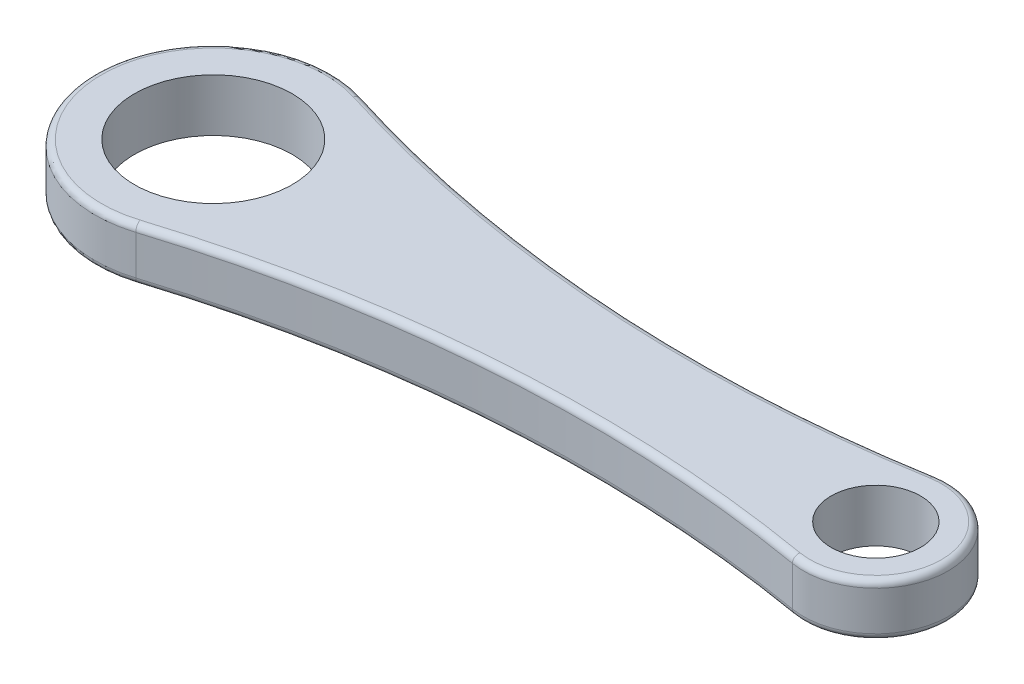
ISO-10303-21;
HEADER;
FILE_DESCRIPTION(('STEP AP214'),'2;1');
FILE_NAME('part.step','',(''),(''),'','','');
FILE_SCHEMA(('AUTOMOTIVE_DESIGN { 1 0 10303 214 1 1 1 1 }'));
ENDSEC;
DATA;
#1=APPLICATION_CONTEXT('core data for automotive mechanical design processes');
#2=APPLICATION_PROTOCOL_DEFINITION('international standard','automotive_design',2000,#1);
#3=PRODUCT_CONTEXT('',#1,'mechanical');
#4=PRODUCT('Part','Part','',(#3));
#5=PRODUCT_RELATED_PRODUCT_CATEGORY('part','',(#4));
#6=PRODUCT_DEFINITION_FORMATION('','',#4);
#7=PRODUCT_DEFINITION_CONTEXT('part definition',#1,'design');
#8=PRODUCT_DEFINITION('design','',#6,#7);
#9=PRODUCT_DEFINITION_SHAPE('','',#8);
#10=(LENGTH_UNIT() NAMED_UNIT(*) SI_UNIT(.MILLI.,.METRE.));
#11=(NAMED_UNIT(*) PLANE_ANGLE_UNIT() SI_UNIT($,.RADIAN.));
#12=(NAMED_UNIT(*) SI_UNIT($,.STERADIAN.) SOLID_ANGLE_UNIT());
#13=UNCERTAINTY_MEASURE_WITH_UNIT(LENGTH_MEASURE(1.E-05),#10,'distance_accuracy_value','');
#14=(GEOMETRIC_REPRESENTATION_CONTEXT(3) GLOBAL_UNCERTAINTY_ASSIGNED_CONTEXT((#13)) GLOBAL_UNIT_ASSIGNED_CONTEXT((#10,
#11,#12)) REPRESENTATION_CONTEXT('',''));
#15=CARTESIAN_POINT('',(0.,0.,0.));
#16=DIRECTION('',(0.,0.,1.));
#17=DIRECTION('',(1.,0.,0.));
#18=AXIS2_PLACEMENT_3D('',#15,#16,#17);
#19=CARTESIAN_POINT('',(41.5295907515883,4.,-52.0811068228716));
#20=DIRECTION('',(0.,1.,0.));
#21=DIRECTION('',(0.,0.,0.999999999999999));
#22=AXIS2_PLACEMENT_3D('',#19,#20,#21);
#23=PLANE('',#22);
#24=CARTESIAN_POINT('',(32.6591815031766,3.99999999999999,-104.162213645743));
#25=DIRECTION('',(0.,1.,0.));
#26=DIRECTION('',(0.,0.,0.999999999999999));
#27=AXIS2_PLACEMENT_3D('',#24,#25,#26);
#28=CIRCLE('',#27,100.662213645743);
#29=CARTESIAN_POINT('',(49.5604937146072,4.,-4.92901909073053));
#30=VERTEX_POINT('',#29);
#31=CARTESIAN_POINT('',(2.54303236903831,3.99999999999999,-8.11067114177509));
#32=VERTEX_POINT('',#31);
#33=EDGE_CURVE('E51',#30,#32,#28,.F.);
#34=ORIENTED_EDGE('',*,*,#33,.T.);
#35=CARTESIAN_POINT('',(0.,4.,0.));
#36=DIRECTION('',(0.,1.,0.));
#37=DIRECTION('',(0.,0.,0.999999999999999));
#38=AXIS2_PLACEMENT_3D('',#35,#36,#37);
#39=CIRCLE('',#38,8.49999999999999);
#40=CARTESIAN_POINT('',(2.54303236903829,4.,8.11067114177508));
#41=VERTEX_POINT('',#40);
#42=EDGE_CURVE('E110',#32,#41,#39,.T.);
#43=ORIENTED_EDGE('',*,*,#42,.T.);
#44=CARTESIAN_POINT('',(32.6591815031766,4.,104.162213645743));
#45=DIRECTION('',(0.,1.,0.));
#46=DIRECTION('',(0.,0.,0.999999999999999));
#47=AXIS2_PLACEMENT_3D('',#44,#45,#46);
#48=CIRCLE('',#47,100.662213645743);
#49=CARTESIAN_POINT('',(49.5604937146072,4.,4.92901909073052));
#50=VERTEX_POINT('',#49);
#51=EDGE_CURVE('E133',#41,#50,#48,.F.);
#52=ORIENTED_EDGE('',*,*,#51,.T.);
#53=CARTESIAN_POINT('',(50.4,4.,0.));
#54=DIRECTION('',(0.,1.,0.));
#55=DIRECTION('',(0.,0.,0.999999999999999));
#56=AXIS2_PLACEMENT_3D('',#53,#54,#55);
#57=CIRCLE('',#56,5.);
#58=EDGE_CURVE('E56',#50,#30,#57,.T.);
#59=ORIENTED_EDGE('',*,*,#58,.T.);
#60=EDGE_LOOP('',(#34,#43,#52,#59));
#61=FACE_BOUND('',#60,.T.);
#62=CARTESIAN_POINT('',(0.,4.,0.));
#63=DIRECTION('',(0.,1.,0.));
#64=DIRECTION('',(0.,0.,0.999999999999999));
#65=AXIS2_PLACEMENT_3D('',#62,#63,#64);
#66=CIRCLE('',#65,6.);
#67=CARTESIAN_POINT('',(0.,4.,-6.00000000000001));
#68=VERTEX_POINT('',#67);
#69=EDGE_CURVE('E170',#68,#68,#66,.T.);
#70=ORIENTED_EDGE('',*,*,#69,.F.);
#71=EDGE_LOOP('',(#70));
#72=FACE_BOUND('',#71,.T.);
#73=CARTESIAN_POINT('',(50.4,4.,0.));
#74=DIRECTION('',(0.,1.,0.));
#75=DIRECTION('',(0.,0.,0.999999999999999));
#76=AXIS2_PLACEMENT_3D('',#73,#74,#75);
#77=CIRCLE('',#76,3.4);
#78=CARTESIAN_POINT('',(50.4,4.,-3.40000000000001));
#79=VERTEX_POINT('',#78);
#80=EDGE_CURVE('E162',#79,#79,#77,.T.);
#81=ORIENTED_EDGE('',*,*,#80,.F.);
#82=EDGE_LOOP('',(#81));
#83=FACE_BOUND('',#82,.T.);
#84=ADVANCED_FACE('F34',(#61,#72,#83),#23,.T.);
#85=CARTESIAN_POINT('',(41.5295907515883,0.,-52.0811068228716));
#86=DIRECTION('',(0.,1.,0.));
#87=DIRECTION('',(0.,0.,0.999999999999999));
#88=AXIS2_PLACEMENT_3D('',#85,#86,#87);
#89=PLANE('',#88);
#90=CARTESIAN_POINT('',(32.6591815031766,0.,104.162213645743));
#91=DIRECTION('',(0.,1.,0.));
#92=DIRECTION('',(0.,0.,0.999999999999999));
#93=AXIS2_PLACEMENT_3D('',#90,#91,#92);
#94=CIRCLE('',#93,100.662213645743);
#95=CARTESIAN_POINT('',(49.5604937146072,0.,4.92901909073051));
#96=VERTEX_POINT('',#95);
#97=CARTESIAN_POINT('',(2.54303236903832,0.,8.11067114177508));
#98=VERTEX_POINT('',#97);
#99=EDGE_CURVE('E181',#96,#98,#94,.T.);
#100=ORIENTED_EDGE('',*,*,#99,.T.);
#101=CARTESIAN_POINT('',(0.,0.,0.));
#102=DIRECTION('',(0.,1.,0.));
#103=DIRECTION('',(0.,0.,0.999999999999999));
#104=AXIS2_PLACEMENT_3D('',#101,#102,#103);
#105=CIRCLE('',#104,8.49999999999999);
#106=CARTESIAN_POINT('',(2.54303236903831,0.,-8.11067114177509));
#107=VERTEX_POINT('',#106);
#108=EDGE_CURVE('E187',#98,#107,#105,.F.);
#109=ORIENTED_EDGE('',*,*,#108,.T.);
#110=CARTESIAN_POINT('',(32.6591815031766,0.,-104.162213645743));
#111=DIRECTION('',(0.,1.,0.));
#112=DIRECTION('',(0.,0.,0.999999999999999));
#113=AXIS2_PLACEMENT_3D('',#110,#111,#112);
#114=CIRCLE('',#113,100.662213645743);
#115=CARTESIAN_POINT('',(49.5604937146072,0.,-4.92901909073052));
#116=VERTEX_POINT('',#115);
#117=EDGE_CURVE('E185',#107,#116,#114,.T.);
#118=ORIENTED_EDGE('',*,*,#117,.T.);
#119=CARTESIAN_POINT('',(50.4,0.,0.));
#120=DIRECTION('',(0.,1.,0.));
#121=DIRECTION('',(0.,0.,0.999999999999999));
#122=AXIS2_PLACEMENT_3D('',#119,#120,#121);
#123=CIRCLE('',#122,5.);
#124=EDGE_CURVE('E183',#116,#96,#123,.F.);
#125=ORIENTED_EDGE('',*,*,#124,.T.);
#126=EDGE_LOOP('',(#100,#109,#118,#125));
#127=FACE_BOUND('',#126,.T.);
#128=CARTESIAN_POINT('',(0.,0.,0.));
#129=DIRECTION('',(0.,1.,0.));
#130=DIRECTION('',(0.,0.,0.999999999999999));
#131=AXIS2_PLACEMENT_3D('',#128,#129,#130);
#132=CIRCLE('',#131,6.);
#133=CARTESIAN_POINT('',(0.,0.,-6.00000000000001));
#134=VERTEX_POINT('',#133);
#135=EDGE_CURVE('E167',#134,#134,#132,.T.);
#136=ORIENTED_EDGE('',*,*,#135,.T.);
#137=EDGE_LOOP('',(#136));
#138=FACE_BOUND('',#137,.T.);
#139=CARTESIAN_POINT('',(50.4,0.,0.));
#140=DIRECTION('',(0.,1.,0.));
#141=DIRECTION('',(0.,0.,0.999999999999999));
#142=AXIS2_PLACEMENT_3D('',#139,#140,#141);
#143=CIRCLE('',#142,3.4);
#144=CARTESIAN_POINT('',(50.4,0.,-3.40000000000001));
#145=VERTEX_POINT('',#144);
#146=EDGE_CURVE('E156',#145,#145,#143,.T.);
#147=ORIENTED_EDGE('',*,*,#146,.T.);
#148=EDGE_LOOP('',(#147));
#149=FACE_BOUND('',#148,.T.);
#150=ADVANCED_FACE('F227',(#127,#138,#149),#89,.F.);
#151=CARTESIAN_POINT('',(32.6591815031766,3.99999999999999,-104.162213645743));
#152=DIRECTION('',(0.,-1.,0.));
#153=DIRECTION('',(0.,0.,-0.999999999999999));
#154=AXIS2_PLACEMENT_3D('',#151,#152,#153);
#155=CYLINDRICAL_SURFACE('',#154,100.162213645743);
#156=DIRECTION('',(0.,-1.,0.));
#157=VECTOR('',#156,1.);
#158=CARTESIAN_POINT('',(49.4765430860679,4.,-5.42192099980359));
#159=LINE('',#158,#157);
#160=CARTESIAN_POINT('',(49.4765430860679,3.5,-5.42192099980358));
#161=VERTEX_POINT('',#160);
#162=CARTESIAN_POINT('',(49.4765430860679,0.5,-5.4219209998036));
#163=VERTEX_POINT('',#162);
#164=EDGE_CURVE('E173',#161,#163,#159,.T.);
#165=ORIENTED_EDGE('',*,*,#164,.T.);
#166=CARTESIAN_POINT('',(32.6591815031766,0.5,-104.162213645743));
#167=DIRECTION('',(0.,1.,0.));
#168=DIRECTION('',(0.,0.,0.999999999999999));
#169=AXIS2_PLACEMENT_3D('',#166,#167,#168);
#170=CIRCLE('',#169,100.162213645743);
#171=CARTESIAN_POINT('',(2.69262250839352,0.5,-8.58776944423245));
#172=VERTEX_POINT('',#171);
#173=EDGE_CURVE('E192',#163,#172,#170,.F.);
#174=ORIENTED_EDGE('',*,*,#173,.T.);
#175=DIRECTION('',(0.,-1.,0.));
#176=VECTOR('',#175,1.);
#177=CARTESIAN_POINT('',(2.69262250839352,4.,-8.58776944423247));
#178=LINE('',#177,#176);
#179=CARTESIAN_POINT('',(2.69262250839351,3.5,-8.58776944423246));
#180=VERTEX_POINT('',#179);
#181=EDGE_CURVE('E122',#180,#172,#178,.T.);
#182=ORIENTED_EDGE('',*,*,#181,.F.);
#183=CARTESIAN_POINT('',(32.6591815031766,3.49999999999999,-104.162213645743));
#184=DIRECTION('',(0.,1.,0.));
#185=DIRECTION('',(0.,0.,0.999999999999999));
#186=AXIS2_PLACEMENT_3D('',#183,#184,#185);
#187=CIRCLE('',#186,100.162213645743);
#188=EDGE_CURVE('E190',#180,#161,#187,.T.);
#189=ORIENTED_EDGE('',*,*,#188,.T.);
#190=EDGE_LOOP('',(#165,#174,#182,#189));
#191=FACE_BOUND('',#190,.T.);
#192=ADVANCED_FACE('F207',(#191),#155,.F.);
#193=CARTESIAN_POINT('',(0.,4.,0.));
#194=DIRECTION('',(0.,-1.,0.));
#195=DIRECTION('',(0.,0.,-0.999999999999999));
#196=AXIS2_PLACEMENT_3D('',#193,#194,#195);
#197=CYLINDRICAL_SURFACE('',#196,9.);
#198=ORIENTED_EDGE('',*,*,#181,.T.);
#199=CARTESIAN_POINT('',(0.,0.5,0.));
#200=DIRECTION('',(0.,1.,0.));
#201=DIRECTION('',(0.,0.,0.999999999999999));
#202=AXIS2_PLACEMENT_3D('',#199,#200,#201);
#203=CIRCLE('',#202,9.);
#204=CARTESIAN_POINT('',(2.69262250839349,0.5,8.58776944423243));
#205=VERTEX_POINT('',#204);
#206=EDGE_CURVE('E121',#172,#205,#203,.T.);
#207=ORIENTED_EDGE('',*,*,#206,.T.);
#208=DIRECTION('',(0.,-1.,0.));
#209=VECTOR('',#208,1.);
#210=CARTESIAN_POINT('',(2.69262250839347,4.,8.58776944423243));
#211=LINE('',#210,#209);
#212=CARTESIAN_POINT('',(2.69262250839346,3.5,8.58776944423242));
#213=VERTEX_POINT('',#212);
#214=EDGE_CURVE('E103',#213,#205,#211,.T.);
#215=ORIENTED_EDGE('',*,*,#214,.F.);
#216=CARTESIAN_POINT('',(0.,3.5,0.));
#217=DIRECTION('',(0.,1.,0.));
#218=DIRECTION('',(0.,0.,0.999999999999999));
#219=AXIS2_PLACEMENT_3D('',#216,#217,#218);
#220=CIRCLE('',#219,9.);
#221=EDGE_CURVE('E118',#213,#180,#220,.F.);
#222=ORIENTED_EDGE('',*,*,#221,.T.);
#223=EDGE_LOOP('',(#198,#207,#215,#222));
#224=FACE_BOUND('',#223,.T.);
#225=ADVANCED_FACE('F117',(#224),#197,.T.);
#226=CARTESIAN_POINT('',(32.6591815031766,4.,104.162213645743));
#227=DIRECTION('',(0.,-1.,0.));
#228=DIRECTION('',(0.,0.,-0.999999999999999));
#229=AXIS2_PLACEMENT_3D('',#226,#227,#228);
#230=CYLINDRICAL_SURFACE('',#229,100.162213645743);
#231=ORIENTED_EDGE('',*,*,#214,.T.);
#232=CARTESIAN_POINT('',(32.6591815031766,0.499999999999987,104.162213645743));
#233=DIRECTION('',(0.,1.,0.));
#234=DIRECTION('',(0.,0.,0.999999999999999));
#235=AXIS2_PLACEMENT_3D('',#232,#233,#234);
#236=CIRCLE('',#235,100.162213645743);
#237=CARTESIAN_POINT('',(49.4765430860679,0.5,5.42192099980356));
#238=VERTEX_POINT('',#237);
#239=EDGE_CURVE('E11',#205,#238,#236,.F.);
#240=ORIENTED_EDGE('',*,*,#239,.T.);
#241=DIRECTION('',(0.,-1.,0.));
#242=VECTOR('',#241,1.);
#243=CARTESIAN_POINT('',(49.4765430860679,4.,5.42192099980356));
#244=LINE('',#243,#242);
#245=CARTESIAN_POINT('',(49.4765430860679,3.49999999999999,5.42192099980355));
#246=VERTEX_POINT('',#245);
#247=EDGE_CURVE('E105',#246,#238,#244,.T.);
#248=ORIENTED_EDGE('',*,*,#247,.F.);
#249=CARTESIAN_POINT('',(32.6591815031766,3.49999999999999,104.162213645743));
#250=DIRECTION('',(0.,1.,0.));
#251=DIRECTION('',(0.,0.,0.999999999999999));
#252=AXIS2_PLACEMENT_3D('',#249,#250,#251);
#253=CIRCLE('',#252,100.162213645743);
#254=EDGE_CURVE('E43',#246,#213,#253,.T.);
#255=ORIENTED_EDGE('',*,*,#254,.T.);
#256=EDGE_LOOP('',(#231,#240,#248,#255));
#257=FACE_BOUND('',#256,.T.);
#258=ADVANCED_FACE('F102',(#257),#230,.F.);
#259=CARTESIAN_POINT('',(50.4,4.,0.));
#260=DIRECTION('',(0.,-1.,0.));
#261=DIRECTION('',(0.,0.,-0.999999999999999));
#262=AXIS2_PLACEMENT_3D('',#259,#260,#261);
#263=CYLINDRICAL_SURFACE('',#262,5.5);
#264=ORIENTED_EDGE('',*,*,#247,.T.);
#265=CARTESIAN_POINT('',(50.4,0.499999999999987,0.));
#266=DIRECTION('',(0.,1.,0.));
#267=DIRECTION('',(0.,0.,0.999999999999999));
#268=AXIS2_PLACEMENT_3D('',#265,#266,#267);
#269=CIRCLE('',#268,5.5);
#270=EDGE_CURVE('E196',#238,#163,#269,.T.);
#271=ORIENTED_EDGE('',*,*,#270,.T.);
#272=ORIENTED_EDGE('',*,*,#164,.F.);
#273=CARTESIAN_POINT('',(50.4,3.5,0.));
#274=DIRECTION('',(0.,1.,0.));
#275=DIRECTION('',(0.,0.,0.999999999999999));
#276=AXIS2_PLACEMENT_3D('',#273,#274,#275);
#277=CIRCLE('',#276,5.5);
#278=EDGE_CURVE('E194',#161,#246,#277,.F.);
#279=ORIENTED_EDGE('',*,*,#278,.T.);
#280=EDGE_LOOP('',(#264,#271,#272,#279));
#281=FACE_BOUND('',#280,.T.);
#282=ADVANCED_FACE('F209',(#281),#263,.T.);
#283=CARTESIAN_POINT('',(0.,4.,0.));
#284=DIRECTION('',(0.,-1.,0.));
#285=DIRECTION('',(0.,0.,-0.999999999999999));
#286=AXIS2_PLACEMENT_3D('',#283,#284,#285);
#287=CYLINDRICAL_SURFACE('',#286,6.);
#288=CARTESIAN_POINT('',(0.,4.,-6.00000000000001));
#289=CARTESIAN_POINT('',(0.,3.95833333333334,-6.00000000000001));
#290=CARTESIAN_POINT('',(0.,3.91666666666667,-6.00000000000001));
#291=CARTESIAN_POINT('',(0.,3.83333333333334,-6.00000000000001));
#292=CARTESIAN_POINT('',(0.,3.79166666666667,-6.00000000000001));
#293=CARTESIAN_POINT('',(0.,3.70833333333334,-6.00000000000001));
#294=CARTESIAN_POINT('',(0.,3.66666666666667,-6.00000000000001));
#295=CARTESIAN_POINT('',(0.,3.58333333333334,-6.00000000000001));
#296=CARTESIAN_POINT('',(0.,3.54166666666667,-6.00000000000001));
#297=CARTESIAN_POINT('',(0.,3.45833333333334,-6.00000000000001));
#298=CARTESIAN_POINT('',(0.,3.41666666666667,-6.00000000000001));
#299=CARTESIAN_POINT('',(0.,3.33333333333334,-6.00000000000001));
#300=CARTESIAN_POINT('',(0.,3.29166666666667,-6.00000000000001));
#301=CARTESIAN_POINT('',(0.,3.20833333333334,-6.00000000000001));
#302=CARTESIAN_POINT('',(0.,3.16666666666667,-6.00000000000001));
#303=CARTESIAN_POINT('',(0.,3.08333333333334,-6.00000000000001));
#304=CARTESIAN_POINT('',(0.,3.04166666666667,-6.00000000000001));
#305=CARTESIAN_POINT('',(0.,2.95833333333334,-6.00000000000001));
#306=CARTESIAN_POINT('',(0.,2.91666666666667,-6.00000000000001));
#307=CARTESIAN_POINT('',(0.,2.83333333333334,-6.00000000000001));
#308=CARTESIAN_POINT('',(0.,2.79166666666667,-6.00000000000001));
#309=CARTESIAN_POINT('',(0.,2.70833333333334,-6.00000000000001));
#310=CARTESIAN_POINT('',(0.,2.66666666666667,-6.00000000000001));
#311=CARTESIAN_POINT('',(0.,2.58333333333334,-6.00000000000001));
#312=CARTESIAN_POINT('',(0.,2.54166666666667,-6.00000000000001));
#313=CARTESIAN_POINT('',(0.,2.45833333333334,-6.00000000000001));
#314=CARTESIAN_POINT('',(0.,2.41666666666667,-6.00000000000001));
#315=CARTESIAN_POINT('',(0.,2.33333333333334,-6.00000000000001));
#316=CARTESIAN_POINT('',(0.,2.29166666666667,-6.00000000000001));
#317=CARTESIAN_POINT('',(0.,2.20833333333334,-6.00000000000001));
#318=CARTESIAN_POINT('',(0.,2.16666666666667,-6.00000000000001));
#319=CARTESIAN_POINT('',(0.,2.08333333333334,-6.00000000000001));
#320=CARTESIAN_POINT('',(0.,2.04166666666667,-6.00000000000001));
#321=CARTESIAN_POINT('',(0.,1.95833333333334,-6.00000000000001));
#322=CARTESIAN_POINT('',(0.,1.91666666666667,-6.00000000000001));
#323=CARTESIAN_POINT('',(0.,1.83333333333334,-6.00000000000001));
#324=CARTESIAN_POINT('',(0.,1.79166666666667,-6.00000000000001));
#325=CARTESIAN_POINT('',(0.,1.70833333333333,-6.00000000000001));
#326=CARTESIAN_POINT('',(0.,1.66666666666667,-6.00000000000001));
#327=CARTESIAN_POINT('',(0.,1.58333333333333,-6.00000000000001));
#328=CARTESIAN_POINT('',(0.,1.54166666666667,-6.00000000000001));
#329=CARTESIAN_POINT('',(0.,1.45833333333333,-6.00000000000001));
#330=CARTESIAN_POINT('',(0.,1.41666666666667,-6.00000000000001));
#331=CARTESIAN_POINT('',(0.,1.33333333333333,-6.00000000000001));
#332=CARTESIAN_POINT('',(0.,1.29166666666667,-6.00000000000001));
#333=CARTESIAN_POINT('',(0.,1.20833333333333,-6.00000000000001));
#334=CARTESIAN_POINT('',(0.,1.16666666666667,-6.00000000000001));
#335=CARTESIAN_POINT('',(0.,1.08333333333333,-6.00000000000001));
#336=CARTESIAN_POINT('',(0.,1.04166666666667,-6.00000000000001));
#337=CARTESIAN_POINT('',(0.,0.958333333333334,-6.00000000000001));
#338=CARTESIAN_POINT('',(0.,0.916666666666667,-6.00000000000001));
#339=CARTESIAN_POINT('',(0.,0.833333333333333,-6.00000000000001));
#340=CARTESIAN_POINT('',(0.,0.791666666666667,-6.00000000000001));
#341=CARTESIAN_POINT('',(0.,0.708333333333333,-6.00000000000001));
#342=CARTESIAN_POINT('',(0.,0.666666666666667,-6.00000000000001));
#343=CARTESIAN_POINT('',(0.,0.583333333333333,-6.00000000000001));
#344=CARTESIAN_POINT('',(0.,0.541666666666667,-6.00000000000001));
#345=CARTESIAN_POINT('',(0.,0.458333333333333,-6.00000000000001));
#346=CARTESIAN_POINT('',(0.,0.416666666666667,-6.00000000000001));
#347=CARTESIAN_POINT('',(0.,0.333333333333333,-6.00000000000001));
#348=CARTESIAN_POINT('',(0.,0.291666666666666,-6.00000000000001));
#349=CARTESIAN_POINT('',(0.,0.208333333333333,-6.00000000000001));
#350=CARTESIAN_POINT('',(0.,0.166666666666666,-6.00000000000001));
#351=CARTESIAN_POINT('',(0.,0.0833333333333328,-6.00000000000001));
#352=CARTESIAN_POINT('',(0.,0.0416666666666664,-6.00000000000001));
#353=CARTESIAN_POINT('',(0.,0.,-6.00000000000001));
#354=B_SPLINE_CURVE_WITH_KNOTS('',3,(#288,#289,#290,#291,#292,#293,#294,#295,#296,#297,#298,
#299,#300,#301,#302,#303,#304,#305,#306,#307,#308,#309,#310,#311,#312,#313,#314,#315,#316,#317,
#318,#319,#320,#321,#322,#323,#324,#325,#326,#327,#328,#329,#330,#331,#332,#333,#334,#335,#336,
#337,#338,#339,#340,#341,#342,#343,#344,#345,#346,#347,#348,#349,#350,#351,#352,#353),
.UNSPECIFIED.,.F.,.F.,(4,2,2,2,2,2,2,2,2,2,2,2,2,2,2,2,2,2,2,2,2,2,2,2,2,2,2,2,2,2,2,2,4),(0.,
0.125000000000001,0.250000000000001,0.375000000000001,0.500000000000001,0.625000000000001,
0.750000000000002,0.875000000000002,1.,1.125,1.25,1.375,1.5,1.625,1.75,1.875,2.,2.125,2.25,
2.375,2.5,2.625,2.75,2.875,3.,3.125,3.25,3.375,3.5,3.625,3.75,3.87500000000001,4.),.UNSPECIFIED.);
#355=EDGE_CURVE('BSEAM235',#68,#134,#354,.T.);
#356=ORIENTED_EDGE('',*,*,#69,.T.);
#357=ORIENTED_EDGE('',*,*,#135,.F.);
#358=ORIENTED_EDGE('',*,*,#355,.T.);
#359=ORIENTED_EDGE('',*,*,#355,.F.);
#360=EDGE_LOOP('',(#356,#358,#357,#359));
#361=FACE_BOUND('',#360,.T.);
#362=ADVANCED_FACE('F235',(#361),#287,.F.);
#363=CARTESIAN_POINT('',(50.4,4.,0.));
#364=DIRECTION('',(0.,-1.,0.));
#365=DIRECTION('',(0.,0.,-0.999999999999999));
#366=AXIS2_PLACEMENT_3D('',#363,#364,#365);
#367=CYLINDRICAL_SURFACE('',#366,3.4);
#368=CARTESIAN_POINT('',(50.4,4.,-3.40000000000001));
#369=CARTESIAN_POINT('',(50.4,3.95833333333334,-3.40000000000001));
#370=CARTESIAN_POINT('',(50.4,3.91666666666667,-3.40000000000001));
#371=CARTESIAN_POINT('',(50.4,3.83333333333334,-3.40000000000001));
#372=CARTESIAN_POINT('',(50.4,3.79166666666667,-3.40000000000001));
#373=CARTESIAN_POINT('',(50.4,3.70833333333334,-3.40000000000001));
#374=CARTESIAN_POINT('',(50.4,3.66666666666667,-3.40000000000001));
#375=CARTESIAN_POINT('',(50.4,3.58333333333334,-3.40000000000001));
#376=CARTESIAN_POINT('',(50.4,3.54166666666667,-3.40000000000001));
#377=CARTESIAN_POINT('',(50.4,3.45833333333334,-3.40000000000001));
#378=CARTESIAN_POINT('',(50.4,3.41666666666667,-3.40000000000001));
#379=CARTESIAN_POINT('',(50.4,3.33333333333334,-3.40000000000001));
#380=CARTESIAN_POINT('',(50.4,3.29166666666667,-3.40000000000001));
#381=CARTESIAN_POINT('',(50.4,3.20833333333334,-3.40000000000001));
#382=CARTESIAN_POINT('',(50.4,3.16666666666667,-3.40000000000001));
#383=CARTESIAN_POINT('',(50.4,3.08333333333334,-3.40000000000001));
#384=CARTESIAN_POINT('',(50.4,3.04166666666667,-3.40000000000001));
#385=CARTESIAN_POINT('',(50.4,2.95833333333334,-3.40000000000001));
#386=CARTESIAN_POINT('',(50.4,2.91666666666667,-3.40000000000001));
#387=CARTESIAN_POINT('',(50.4,2.83333333333334,-3.40000000000001));
#388=CARTESIAN_POINT('',(50.4,2.79166666666667,-3.40000000000001));
#389=CARTESIAN_POINT('',(50.4,2.70833333333334,-3.40000000000001));
#390=CARTESIAN_POINT('',(50.4,2.66666666666667,-3.40000000000001));
#391=CARTESIAN_POINT('',(50.4,2.58333333333334,-3.40000000000001));
#392=CARTESIAN_POINT('',(50.4,2.54166666666667,-3.40000000000001));
#393=CARTESIAN_POINT('',(50.4,2.45833333333333,-3.40000000000001));
#394=CARTESIAN_POINT('',(50.4,2.41666666666667,-3.40000000000001));
#395=CARTESIAN_POINT('',(50.4,2.33333333333334,-3.40000000000001));
#396=CARTESIAN_POINT('',(50.4,2.29166666666667,-3.40000000000001));
#397=CARTESIAN_POINT('',(50.4,2.20833333333334,-3.40000000000001));
#398=CARTESIAN_POINT('',(50.4,2.16666666666667,-3.40000000000001));
#399=CARTESIAN_POINT('',(50.4,2.08333333333334,-3.40000000000001));
#400=CARTESIAN_POINT('',(50.4,2.04166666666667,-3.40000000000001));
#401=CARTESIAN_POINT('',(50.4,1.95833333333334,-3.40000000000001));
#402=CARTESIAN_POINT('',(50.4,1.91666666666667,-3.40000000000001));
#403=CARTESIAN_POINT('',(50.4,1.83333333333334,-3.40000000000001));
#404=CARTESIAN_POINT('',(50.4,1.79166666666667,-3.40000000000001));
#405=CARTESIAN_POINT('',(50.4,1.70833333333333,-3.40000000000001));
#406=CARTESIAN_POINT('',(50.4,1.66666666666667,-3.40000000000001));
#407=CARTESIAN_POINT('',(50.4,1.58333333333333,-3.40000000000001));
#408=CARTESIAN_POINT('',(50.4,1.54166666666667,-3.40000000000001));
#409=CARTESIAN_POINT('',(50.4,1.45833333333333,-3.40000000000001));
#410=CARTESIAN_POINT('',(50.4,1.41666666666667,-3.40000000000001));
#411=CARTESIAN_POINT('',(50.4,1.33333333333333,-3.40000000000001));
#412=CARTESIAN_POINT('',(50.4,1.29166666666667,-3.40000000000001));
#413=CARTESIAN_POINT('',(50.4,1.20833333333333,-3.40000000000001));
#414=CARTESIAN_POINT('',(50.4,1.16666666666667,-3.40000000000001));
#415=CARTESIAN_POINT('',(50.4,1.08333333333333,-3.40000000000001));
#416=CARTESIAN_POINT('',(50.4,1.04166666666667,-3.40000000000001));
#417=CARTESIAN_POINT('',(50.4,0.958333333333334,-3.40000000000001));
#418=CARTESIAN_POINT('',(50.4,0.916666666666667,-3.40000000000001));
#419=CARTESIAN_POINT('',(50.4,0.833333333333334,-3.40000000000001));
#420=CARTESIAN_POINT('',(50.4,0.791666666666667,-3.40000000000001));
#421=CARTESIAN_POINT('',(50.4,0.708333333333334,-3.40000000000001));
#422=CARTESIAN_POINT('',(50.4,0.666666666666667,-3.40000000000001));
#423=CARTESIAN_POINT('',(50.4,0.583333333333334,-3.40000000000001));
#424=CARTESIAN_POINT('',(50.4,0.541666666666667,-3.40000000000001));
#425=CARTESIAN_POINT('',(50.4,0.458333333333334,-3.40000000000001));
#426=CARTESIAN_POINT('',(50.4,0.416666666666667,-3.40000000000001));
#427=CARTESIAN_POINT('',(50.4,0.333333333333334,-3.40000000000001));
#428=CARTESIAN_POINT('',(50.4,0.291666666666667,-3.40000000000001));
#429=CARTESIAN_POINT('',(50.4,0.208333333333334,-3.40000000000001));
#430=CARTESIAN_POINT('',(50.4,0.166666666666667,-3.40000000000001));
#431=CARTESIAN_POINT('',(50.4,0.0833333333333334,-3.40000000000001));
#432=CARTESIAN_POINT('',(50.4,0.0416666666666667,-3.40000000000001));
#433=CARTESIAN_POINT('',(50.4,0.,-3.40000000000001));
#434=B_SPLINE_CURVE_WITH_KNOTS('',3,(#368,#369,#370,#371,#372,#373,#374,#375,#376,#377,#378,
#379,#380,#381,#382,#383,#384,#385,#386,#387,#388,#389,#390,#391,#392,#393,#394,#395,#396,#397,
#398,#399,#400,#401,#402,#403,#404,#405,#406,#407,#408,#409,#410,#411,#412,#413,#414,#415,#416,
#417,#418,#419,#420,#421,#422,#423,#424,#425,#426,#427,#428,#429,#430,#431,#432,#433),
.UNSPECIFIED.,.F.,.F.,(4,2,2,2,2,2,2,2,2,2,2,2,2,2,2,2,2,2,2,2,2,2,2,2,2,2,2,2,2,2,2,2,4),(0.,
0.125,0.25,0.375,0.5,0.625,0.75,0.875,1.,1.125,1.25,1.375,1.5,1.625,1.75,1.875,2.,2.125,2.25,
2.375,2.5,2.625,2.75,2.875,3.,3.125,3.25,3.375,3.5,3.625,3.75,3.875,4.),.UNSPECIFIED.);
#435=EDGE_CURVE('BSEAM266',#79,#145,#434,.T.);
#436=ORIENTED_EDGE('',*,*,#80,.T.);
#437=ORIENTED_EDGE('',*,*,#146,.F.);
#438=ORIENTED_EDGE('',*,*,#435,.T.);
#439=ORIENTED_EDGE('',*,*,#435,.F.);
#440=EDGE_LOOP('',(#436,#438,#437,#439));
#441=FACE_BOUND('',#440,.T.);
#442=ADVANCED_FACE('F266',(#441),#367,.F.);
#443=CARTESIAN_POINT('',(50.4,0.499999999999987,0.));
#444=DIRECTION('',(0.,1.,0.));
#445=DIRECTION('',(0.,0.,0.999999999999999));
#446=AXIS2_PLACEMENT_3D('',#443,#444,#445);
#447=TOROIDAL_SURFACE('',#446,5.,0.5);
#448=CARTESIAN_POINT('',(49.5604937146072,0.5,4.92901909073049));
#449=DIRECTION('',(-0.985803818146106,0.,-0.167901257078551));
#450=DIRECTION('',(-0.167901257078551,0.,0.985803818146106));
#451=AXIS2_PLACEMENT_3D('',#448,#449,#450);
#452=CIRCLE('',#451,0.5);
#453=EDGE_CURVE('E149',#96,#238,#452,.T.);
#454=ORIENTED_EDGE('',*,*,#453,.F.);
#455=ORIENTED_EDGE('',*,*,#124,.F.);
#456=CARTESIAN_POINT('',(49.5604937146072,0.5,-4.92901909073053));
#457=DIRECTION('',(-0.985803818146106,0.,0.167901257078551));
#458=DIRECTION('',(0.167901257078551,0.,0.985803818146106));
#459=AXIS2_PLACEMENT_3D('',#456,#457,#458);
#460=CIRCLE('',#459,0.5);
#461=EDGE_CURVE('E138',#163,#116,#460,.T.);
#462=ORIENTED_EDGE('',*,*,#461,.F.);
#463=ORIENTED_EDGE('',*,*,#270,.F.);
#464=EDGE_LOOP('',(#454,#455,#462,#463));
#465=FACE_BOUND('',#464,.T.);
#466=ADVANCED_FACE('F212',(#465),#447,.T.);
#467=CARTESIAN_POINT('',(32.6591815031766,0.5,-104.162213645743));
#468=DIRECTION('',(0.,1.,0.));
#469=DIRECTION('',(0.,0.,0.999999999999999));
#470=AXIS2_PLACEMENT_3D('',#467,#468,#469);
#471=TOROIDAL_SURFACE('',#470,100.662213645743,0.5);
#472=ORIENTED_EDGE('',*,*,#461,.T.);
#473=ORIENTED_EDGE('',*,*,#117,.F.);
#474=CARTESIAN_POINT('',(2.54303236903832,0.5,-8.11067114177512));
#475=DIRECTION('',(-0.954196604914717,0.,-0.29918027871039));
#476=DIRECTION('',(-0.29918027871039,0.,0.954196604914717));
#477=AXIS2_PLACEMENT_3D('',#474,#475,#476);
#478=CIRCLE('',#477,0.5);
#479=EDGE_CURVE('E143',#172,#107,#478,.T.);
#480=ORIENTED_EDGE('',*,*,#479,.F.);
#481=ORIENTED_EDGE('',*,*,#173,.F.);
#482=EDGE_LOOP('',(#472,#473,#480,#481));
#483=FACE_BOUND('',#482,.T.);
#484=ADVANCED_FACE('F215',(#483),#471,.T.);
#485=CARTESIAN_POINT('',(32.6591815031766,0.499999999999987,104.162213645743));
#486=DIRECTION('',(0.,1.,0.));
#487=DIRECTION('',(0.,0.,0.999999999999999));
#488=AXIS2_PLACEMENT_3D('',#485,#486,#487);
#489=TOROIDAL_SURFACE('',#488,100.662213645743,0.5);
#490=ORIENTED_EDGE('',*,*,#453,.T.);
#491=ORIENTED_EDGE('',*,*,#239,.F.);
#492=CARTESIAN_POINT('',(2.54303236903831,0.5,8.11067114177506));
#493=DIRECTION('',(-0.954196604914718,0.,0.299180278710387));
#494=DIRECTION('',(0.299180278710387,0.,0.954196604914718));
#495=AXIS2_PLACEMENT_3D('',#492,#493,#494);
#496=CIRCLE('',#495,0.5);
#497=EDGE_CURVE('E141',#98,#205,#496,.T.);
#498=ORIENTED_EDGE('',*,*,#497,.F.);
#499=ORIENTED_EDGE('',*,*,#99,.F.);
#500=EDGE_LOOP('',(#490,#491,#498,#499));
#501=FACE_BOUND('',#500,.T.);
#502=ADVANCED_FACE('F218',(#501),#489,.T.);
#503=CARTESIAN_POINT('',(0.,0.5,0.));
#504=DIRECTION('',(0.,1.,0.));
#505=DIRECTION('',(0.,0.,0.999999999999999));
#506=AXIS2_PLACEMENT_3D('',#503,#504,#505);
#507=TOROIDAL_SURFACE('',#506,8.49999999999999,0.5);
#508=ORIENTED_EDGE('',*,*,#479,.T.);
#509=ORIENTED_EDGE('',*,*,#108,.F.);
#510=ORIENTED_EDGE('',*,*,#497,.T.);
#511=ORIENTED_EDGE('',*,*,#206,.F.);
#512=EDGE_LOOP('',(#508,#509,#510,#511));
#513=FACE_BOUND('',#512,.T.);
#514=ADVANCED_FACE('F216',(#513),#507,.T.);
#515=CARTESIAN_POINT('',(50.4,3.5,0.));
#516=DIRECTION('',(0.,1.,0.));
#517=DIRECTION('',(0.,0.,0.999999999999999));
#518=AXIS2_PLACEMENT_3D('',#515,#516,#517);
#519=TOROIDAL_SURFACE('',#518,5.,0.5);
#520=CARTESIAN_POINT('',(49.5604937146072,3.49999999999999,4.92901909073051));
#521=DIRECTION('',(-0.985803818146106,0.,-0.167901257078551));
#522=DIRECTION('',(-0.167901257078551,0.,0.985803818146106));
#523=AXIS2_PLACEMENT_3D('',#520,#521,#522);
#524=CIRCLE('',#523,0.5);
#525=EDGE_CURVE('E135',#246,#50,#524,.T.);
#526=ORIENTED_EDGE('',*,*,#525,.F.);
#527=ORIENTED_EDGE('',*,*,#278,.F.);
#528=CARTESIAN_POINT('',(49.5604937146072,3.5,-4.92901909073053));
#529=DIRECTION('',(-0.985803818146106,0.,0.167901257078551));
#530=DIRECTION('',(0.167901257078551,0.,0.985803818146106));
#531=AXIS2_PLACEMENT_3D('',#528,#529,#530);
#532=CIRCLE('',#531,0.5);
#533=EDGE_CURVE('E38',#30,#161,#532,.T.);
#534=ORIENTED_EDGE('',*,*,#533,.F.);
#535=ORIENTED_EDGE('',*,*,#58,.F.);
#536=EDGE_LOOP('',(#526,#527,#534,#535));
#537=FACE_BOUND('',#536,.T.);
#538=ADVANCED_FACE('F36',(#537),#519,.T.);
#539=CARTESIAN_POINT('',(32.6591815031766,3.49999999999999,-104.162213645743));
#540=DIRECTION('',(0.,1.,0.));
#541=DIRECTION('',(0.,0.,0.999999999999999));
#542=AXIS2_PLACEMENT_3D('',#539,#540,#541);
#543=TOROIDAL_SURFACE('',#542,100.662213645743,0.5);
#544=ORIENTED_EDGE('',*,*,#533,.T.);
#545=ORIENTED_EDGE('',*,*,#188,.F.);
#546=CARTESIAN_POINT('',(2.54303236903833,3.5,-8.11067114177509));
#547=DIRECTION('',(-0.954196604914717,0.,-0.29918027871039));
#548=DIRECTION('',(-0.29918027871039,0.,0.954196604914717));
#549=AXIS2_PLACEMENT_3D('',#546,#547,#548);
#550=CIRCLE('',#549,0.5);
#551=EDGE_CURVE('E129',#32,#180,#550,.T.);
#552=ORIENTED_EDGE('',*,*,#551,.F.);
#553=ORIENTED_EDGE('',*,*,#33,.F.);
#554=EDGE_LOOP('',(#544,#545,#552,#553));
#555=FACE_BOUND('',#554,.T.);
#556=ADVANCED_FACE('F204',(#555),#543,.T.);
#557=CARTESIAN_POINT('',(32.6591815031766,3.49999999999999,104.162213645743));
#558=DIRECTION('',(0.,1.,0.));
#559=DIRECTION('',(0.,0.,0.999999999999999));
#560=AXIS2_PLACEMENT_3D('',#557,#558,#559);
#561=TOROIDAL_SURFACE('',#560,100.662213645743,0.5);
#562=ORIENTED_EDGE('',*,*,#525,.T.);
#563=ORIENTED_EDGE('',*,*,#51,.F.);
#564=CARTESIAN_POINT('',(2.54303236903827,3.5,8.11067114177506));
#565=DIRECTION('',(-0.954196604914717,0.,0.29918027871039));
#566=DIRECTION('',(0.29918027871039,0.,0.954196604914716));
#567=AXIS2_PLACEMENT_3D('',#564,#565,#566);
#568=CIRCLE('',#567,0.5);
#569=EDGE_CURVE('E127',#213,#41,#568,.T.);
#570=ORIENTED_EDGE('',*,*,#569,.F.);
#571=ORIENTED_EDGE('',*,*,#254,.F.);
#572=EDGE_LOOP('',(#562,#563,#570,#571));
#573=FACE_BOUND('',#572,.T.);
#574=ADVANCED_FACE('F132',(#573),#561,.T.);
#575=CARTESIAN_POINT('',(0.,3.5,0.));
#576=DIRECTION('',(0.,1.,0.));
#577=DIRECTION('',(0.,0.,0.999999999999999));
#578=AXIS2_PLACEMENT_3D('',#575,#576,#577);
#579=TOROIDAL_SURFACE('',#578,8.49999999999999,0.5);
#580=ORIENTED_EDGE('',*,*,#551,.T.);
#581=ORIENTED_EDGE('',*,*,#221,.F.);
#582=ORIENTED_EDGE('',*,*,#569,.T.);
#583=ORIENTED_EDGE('',*,*,#42,.F.);
#584=EDGE_LOOP('',(#580,#581,#582,#583));
#585=FACE_BOUND('',#584,.T.);
#586=ADVANCED_FACE('F125',(#585),#579,.T.);
#587=CLOSED_SHELL('',(#84,#150,#192,#225,#258,#282,#362,#442,#466,#484,#502,#514,#538,#556,#574,#586));
#588=MANIFOLD_SOLID_BREP('B2',#587);
#589=ADVANCED_BREP_SHAPE_REPRESENTATION('',(#18,#588),#14);
#590=SHAPE_DEFINITION_REPRESENTATION(#9,#589);
ENDSEC;
END-ISO-10303-21;
